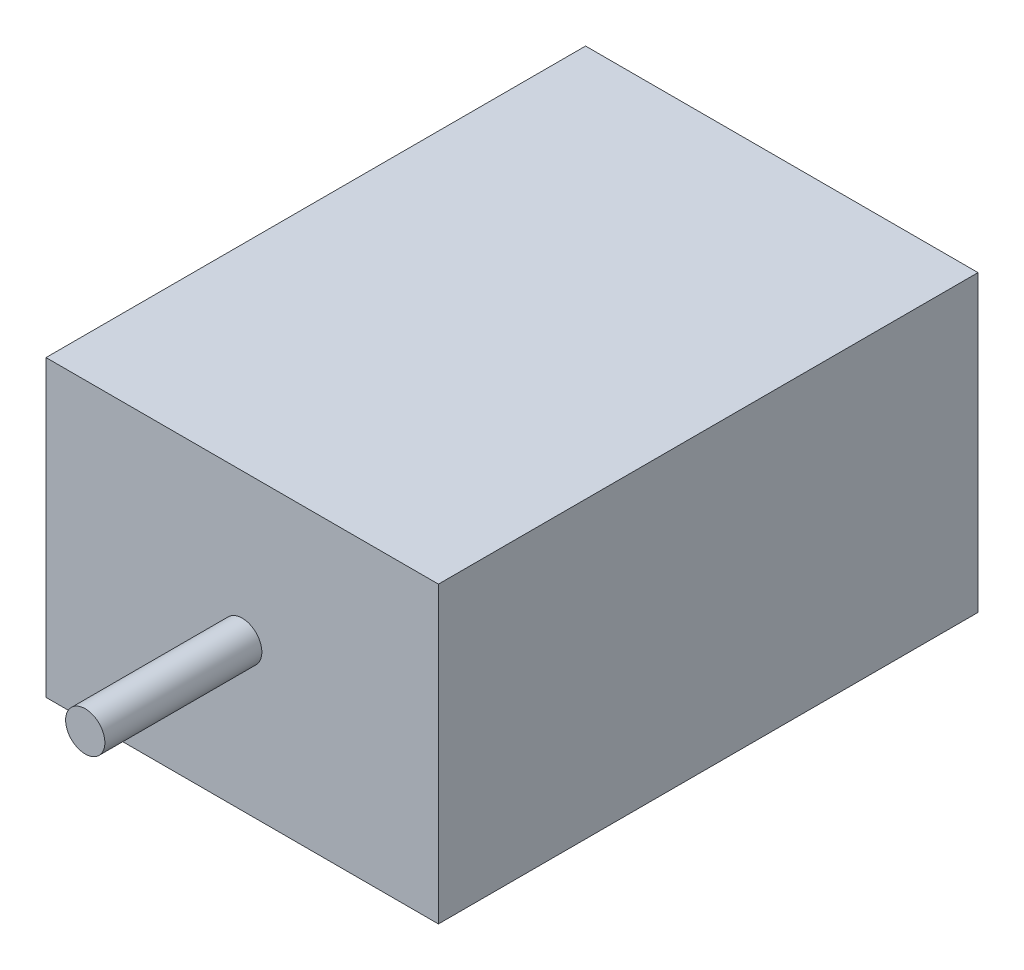
ISO-10303-21;
HEADER;
FILE_DESCRIPTION(('STEP AP214'),'2;1');
FILE_NAME('part.step','',(''),(''),'','','');
FILE_SCHEMA(('AUTOMOTIVE_DESIGN { 1 0 10303 214 1 1 1 1 }'));
ENDSEC;
DATA;
#1=APPLICATION_CONTEXT('core data for automotive mechanical design processes');
#2=APPLICATION_PROTOCOL_DEFINITION('international standard','automotive_design',2000,#1);
#3=PRODUCT_CONTEXT('',#1,'mechanical');
#4=PRODUCT('Part','Part','',(#3));
#5=PRODUCT_RELATED_PRODUCT_CATEGORY('part','',(#4));
#6=PRODUCT_DEFINITION_FORMATION('','',#4);
#7=PRODUCT_DEFINITION_CONTEXT('part definition',#1,'design');
#8=PRODUCT_DEFINITION('design','',#6,#7);
#9=PRODUCT_DEFINITION_SHAPE('','',#8);
#10=(LENGTH_UNIT() NAMED_UNIT(*) SI_UNIT(.MILLI.,.METRE.));
#11=(NAMED_UNIT(*) PLANE_ANGLE_UNIT() SI_UNIT($,.RADIAN.));
#12=(NAMED_UNIT(*) SI_UNIT($,.STERADIAN.) SOLID_ANGLE_UNIT());
#13=UNCERTAINTY_MEASURE_WITH_UNIT(LENGTH_MEASURE(1.E-05),#10,'distance_accuracy_value','');
#14=(GEOMETRIC_REPRESENTATION_CONTEXT(3) GLOBAL_UNCERTAINTY_ASSIGNED_CONTEXT((#13)) GLOBAL_UNIT_ASSIGNED_CONTEXT((#10,
#11,#12)) REPRESENTATION_CONTEXT('',''));
#15=CARTESIAN_POINT('',(0.,0.,0.));
#16=DIRECTION('',(0.,0.,1.));
#17=DIRECTION('',(1.,0.,0.));
#18=AXIS2_PLACEMENT_3D('',#15,#16,#17);
#19=CARTESIAN_POINT('',(-10.,-7.5,27.5));
#20=DIRECTION('',(1.,0.,0.));
#21=DIRECTION('',(0.,0.,-1.));
#22=AXIS2_PLACEMENT_3D('',#19,#20,#21);
#23=PLANE('',#22);
#24=DIRECTION('',(0.,-1.,0.));
#25=VECTOR('',#24,1.);
#26=CARTESIAN_POINT('',(-10.,-7.5,0.));
#27=LINE('',#26,#25);
#28=CARTESIAN_POINT('',(-10.,7.5,0.));
#29=VERTEX_POINT('',#28);
#30=CARTESIAN_POINT('',(-10.,-7.5,0.));
#31=VERTEX_POINT('',#30);
#32=EDGE_CURVE('E105',#29,#31,#27,.T.);
#33=ORIENTED_EDGE('',*,*,#32,.T.);
#34=DIRECTION('',(0.,0.,-1.));
#35=VECTOR('',#34,1.);
#36=CARTESIAN_POINT('',(-10.,-7.5,27.5));
#37=LINE('',#36,#35);
#38=CARTESIAN_POINT('',(-10.,-7.5,27.5));
#39=VERTEX_POINT('',#38);
#40=EDGE_CURVE('E47',#39,#31,#37,.T.);
#41=ORIENTED_EDGE('',*,*,#40,.F.);
#42=DIRECTION('',(0.,-1.,0.));
#43=VECTOR('',#42,1.);
#44=CARTESIAN_POINT('',(-10.,-7.5,27.5));
#45=LINE('',#44,#43);
#46=CARTESIAN_POINT('',(-10.,7.5,27.5));
#47=VERTEX_POINT('',#46);
#48=EDGE_CURVE('E91',#47,#39,#45,.T.);
#49=ORIENTED_EDGE('',*,*,#48,.F.);
#50=DIRECTION('',(0.,0.,-1.));
#51=VECTOR('',#50,1.);
#52=CARTESIAN_POINT('',(-10.,7.5,27.5));
#53=LINE('',#52,#51);
#54=EDGE_CURVE('E101',#47,#29,#53,.T.);
#55=ORIENTED_EDGE('',*,*,#54,.T.);
#56=EDGE_LOOP('',(#33,#41,#49,#55));
#57=FACE_BOUND('',#56,.T.);
#58=ADVANCED_FACE('F39',(#57),#23,.F.);
#59=CARTESIAN_POINT('',(-10.,-7.5,27.5));
#60=DIRECTION('',(0.,1.,0.));
#61=DIRECTION('',(0.,0.,1.));
#62=AXIS2_PLACEMENT_3D('',#59,#60,#61);
#63=PLANE('',#62);
#64=DIRECTION('',(1.,0.,0.));
#65=VECTOR('',#64,1.);
#66=CARTESIAN_POINT('',(-10.,-7.5,0.));
#67=LINE('',#66,#65);
#68=CARTESIAN_POINT('',(10.,-7.5,0.));
#69=VERTEX_POINT('',#68);
#70=EDGE_CURVE('E96',#31,#69,#67,.T.);
#71=ORIENTED_EDGE('',*,*,#70,.T.);
#72=DIRECTION('',(0.,0.,-1.));
#73=VECTOR('',#72,1.);
#74=CARTESIAN_POINT('',(10.,-7.5,27.5));
#75=LINE('',#74,#73);
#76=CARTESIAN_POINT('',(10.,-7.5,27.5));
#77=VERTEX_POINT('',#76);
#78=EDGE_CURVE('E94',#77,#69,#75,.T.);
#79=ORIENTED_EDGE('',*,*,#78,.F.);
#80=DIRECTION('',(1.,0.,0.));
#81=VECTOR('',#80,1.);
#82=CARTESIAN_POINT('',(-10.,-7.5,27.5));
#83=LINE('',#82,#81);
#84=EDGE_CURVE('E86',#39,#77,#83,.T.);
#85=ORIENTED_EDGE('',*,*,#84,.F.);
#86=ORIENTED_EDGE('',*,*,#40,.T.);
#87=EDGE_LOOP('',(#71,#79,#85,#86));
#88=FACE_BOUND('',#87,.T.);
#89=ADVANCED_FACE('F95',(#88),#63,.F.);
#90=CARTESIAN_POINT('',(10.,-7.5,27.5));
#91=DIRECTION('',(-1.,0.,0.));
#92=DIRECTION('',(0.,0.,1.));
#93=AXIS2_PLACEMENT_3D('',#90,#91,#92);
#94=PLANE('',#93);
#95=DIRECTION('',(0.,1.,0.));
#96=VECTOR('',#95,1.);
#97=CARTESIAN_POINT('',(10.,-7.5,0.));
#98=LINE('',#97,#96);
#99=CARTESIAN_POINT('',(10.,7.5,0.));
#100=VERTEX_POINT('',#99);
#101=EDGE_CURVE('E72',#69,#100,#98,.T.);
#102=ORIENTED_EDGE('',*,*,#101,.T.);
#103=DIRECTION('',(0.,0.,-1.));
#104=VECTOR('',#103,1.);
#105=CARTESIAN_POINT('',(10.,7.5,27.5));
#106=LINE('',#105,#104);
#107=CARTESIAN_POINT('',(10.,7.5,27.5));
#108=VERTEX_POINT('',#107);
#109=EDGE_CURVE('E97',#108,#100,#106,.T.);
#110=ORIENTED_EDGE('',*,*,#109,.F.);
#111=DIRECTION('',(0.,1.,0.));
#112=VECTOR('',#111,1.);
#113=CARTESIAN_POINT('',(10.,-7.5,27.5));
#114=LINE('',#113,#112);
#115=EDGE_CURVE('E89',#77,#108,#114,.T.);
#116=ORIENTED_EDGE('',*,*,#115,.F.);
#117=ORIENTED_EDGE('',*,*,#78,.T.);
#118=EDGE_LOOP('',(#102,#110,#116,#117));
#119=FACE_BOUND('',#118,.T.);
#120=ADVANCED_FACE('F99',(#119),#94,.F.);
#121=CARTESIAN_POINT('',(-10.,7.5,27.5));
#122=DIRECTION('',(0.,-1.,0.));
#123=DIRECTION('',(0.,0.,-1.));
#124=AXIS2_PLACEMENT_3D('',#121,#122,#123);
#125=PLANE('',#124);
#126=DIRECTION('',(-1.,0.,0.));
#127=VECTOR('',#126,1.);
#128=CARTESIAN_POINT('',(-10.,7.5,0.));
#129=LINE('',#128,#127);
#130=EDGE_CURVE('E78',#100,#29,#129,.T.);
#131=ORIENTED_EDGE('',*,*,#130,.T.);
#132=ORIENTED_EDGE('',*,*,#54,.F.);
#133=DIRECTION('',(-1.,0.,0.));
#134=VECTOR('',#133,1.);
#135=CARTESIAN_POINT('',(-10.,7.5,27.5));
#136=LINE('',#135,#134);
#137=EDGE_CURVE('E55',#108,#47,#136,.T.);
#138=ORIENTED_EDGE('',*,*,#137,.F.);
#139=ORIENTED_EDGE('',*,*,#109,.T.);
#140=EDGE_LOOP('',(#131,#132,#138,#139));
#141=FACE_BOUND('',#140,.T.);
#142=ADVANCED_FACE('F128',(#141),#125,.F.);
#143=CARTESIAN_POINT('',(0.,0.,27.5));
#144=DIRECTION('',(0.,0.,-1.));
#145=DIRECTION('',(-1.,0.,0.));
#146=AXIS2_PLACEMENT_3D('',#143,#144,#145);
#147=PLANE('',#146);
#148=CARTESIAN_POINT('',(0.,0.,27.5));
#149=DIRECTION('',(0.,0.,-1.));
#150=DIRECTION('',(-1.,0.,0.));
#151=AXIS2_PLACEMENT_3D('',#148,#149,#150);
#152=CIRCLE('',#151,1.);
#153=CARTESIAN_POINT('',(-1.,0.,27.5));
#154=VERTEX_POINT('',#153);
#155=EDGE_CURVE('E11',#154,#154,#152,.F.);
#156=ORIENTED_EDGE('',*,*,#155,.F.);
#157=EDGE_LOOP('',(#156));
#158=FACE_BOUND('',#157,.T.);
#159=ORIENTED_EDGE('',*,*,#48,.T.);
#160=ORIENTED_EDGE('',*,*,#84,.T.);
#161=ORIENTED_EDGE('',*,*,#115,.T.);
#162=ORIENTED_EDGE('',*,*,#137,.T.);
#163=EDGE_LOOP('',(#159,#160,#161,#162));
#164=FACE_BOUND('',#163,.T.);
#165=ADVANCED_FACE('F87',(#158,#164),#147,.F.);
#166=CARTESIAN_POINT('',(0.,0.,0.));
#167=DIRECTION('',(0.,0.,-1.));
#168=DIRECTION('',(-1.,0.,0.));
#169=AXIS2_PLACEMENT_3D('',#166,#167,#168);
#170=PLANE('',#169);
#171=ORIENTED_EDGE('',*,*,#32,.F.);
#172=ORIENTED_EDGE('',*,*,#130,.F.);
#173=ORIENTED_EDGE('',*,*,#101,.F.);
#174=ORIENTED_EDGE('',*,*,#70,.F.);
#175=EDGE_LOOP('',(#171,#172,#173,#174));
#176=FACE_BOUND('',#175,.T.);
#177=ADVANCED_FACE('F116',(#176),#170,.T.);
#178=CARTESIAN_POINT('',(0.,0.,35.5));
#179=DIRECTION('',(0.,0.,-1.));
#180=DIRECTION('',(-1.,0.,0.));
#181=AXIS2_PLACEMENT_3D('',#178,#179,#180);
#182=CYLINDRICAL_SURFACE('',#181,1.);
#183=CARTESIAN_POINT('',(0.,0.,35.5));
#184=DIRECTION('',(0.,0.,1.));
#185=DIRECTION('',(1.,0.,0.));
#186=AXIS2_PLACEMENT_3D('',#183,#184,#185);
#187=CIRCLE('',#186,1.);
#188=CARTESIAN_POINT('',(1.,0.,35.5));
#189=VERTEX_POINT('',#188);
#190=EDGE_CURVE('E108',#189,#189,#187,.T.);
#191=ORIENTED_EDGE('',*,*,#190,.F.);
#192=EDGE_LOOP('',(#191));
#193=FACE_BOUND('',#192,.T.);
#194=ORIENTED_EDGE('',*,*,#155,.T.);
#195=EDGE_LOOP('',(#194));
#196=FACE_BOUND('',#195,.T.);
#197=ADVANCED_FACE('F118',(#193,#196),#182,.T.);
#198=CARTESIAN_POINT('',(0.,0.,35.5));
#199=DIRECTION('',(0.,0.,1.));
#200=DIRECTION('',(1.,0.,0.));
#201=AXIS2_PLACEMENT_3D('',#198,#199,#200);
#202=PLANE('',#201);
#203=ORIENTED_EDGE('',*,*,#190,.T.);
#204=EDGE_LOOP('',(#203));
#205=FACE_BOUND('',#204,.T.);
#206=ADVANCED_FACE('F125',(#205),#202,.T.);
#207=CLOSED_SHELL('',(#58,#89,#120,#142,#165,#177,#197,#206));
#208=MANIFOLD_SOLID_BREP('B2',#207);
#209=ADVANCED_BREP_SHAPE_REPRESENTATION('',(#18,#208),#14);
#210=SHAPE_DEFINITION_REPRESENTATION(#9,#209);
ENDSEC;
END-ISO-10303-21;
